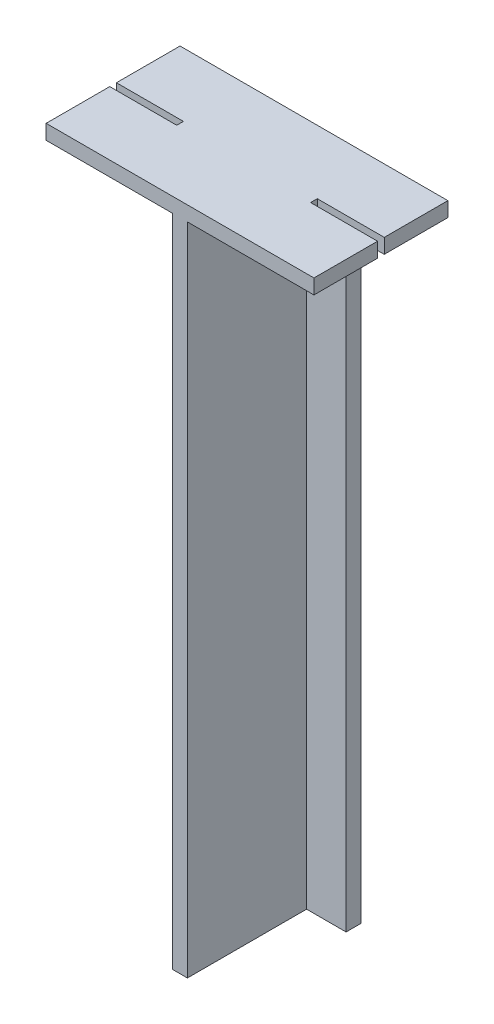
ISO-10303-21;
HEADER;
FILE_DESCRIPTION(('STEP AP214'),'2;1');
FILE_NAME('part.step','',(''),(''),'','','');
FILE_SCHEMA(('AUTOMOTIVE_DESIGN { 1 0 10303 214 1 1 1 1 }'));
ENDSEC;
DATA;
#1=APPLICATION_CONTEXT('core data for automotive mechanical design processes');
#2=APPLICATION_PROTOCOL_DEFINITION('international standard','automotive_design',2000,#1);
#3=PRODUCT_CONTEXT('',#1,'mechanical');
#4=PRODUCT('Part','Part','',(#3));
#5=PRODUCT_RELATED_PRODUCT_CATEGORY('part','',(#4));
#6=PRODUCT_DEFINITION_FORMATION('','',#4);
#7=PRODUCT_DEFINITION_CONTEXT('part definition',#1,'design');
#8=PRODUCT_DEFINITION('design','',#6,#7);
#9=PRODUCT_DEFINITION_SHAPE('','',#8);
#10=(LENGTH_UNIT() NAMED_UNIT(*) SI_UNIT(.MILLI.,.METRE.));
#11=(NAMED_UNIT(*) PLANE_ANGLE_UNIT() SI_UNIT($,.RADIAN.));
#12=(NAMED_UNIT(*) SI_UNIT($,.STERADIAN.) SOLID_ANGLE_UNIT());
#13=UNCERTAINTY_MEASURE_WITH_UNIT(LENGTH_MEASURE(1.E-05),#10,'distance_accuracy_value','');
#14=(GEOMETRIC_REPRESENTATION_CONTEXT(3) GLOBAL_UNCERTAINTY_ASSIGNED_CONTEXT((#13)) GLOBAL_UNIT_ASSIGNED_CONTEXT((#10,
#11,#12)) REPRESENTATION_CONTEXT('',''));
#15=CARTESIAN_POINT('',(0.,0.,0.));
#16=DIRECTION('',(0.,0.,1.));
#17=DIRECTION('',(1.,0.,0.));
#18=AXIS2_PLACEMENT_3D('',#15,#16,#17);
#19=CARTESIAN_POINT('',(0.,0.,0.));
#20=DIRECTION('',(0.,1.,0.));
#21=DIRECTION('',(0.,0.,1.));
#22=AXIS2_PLACEMENT_3D('',#19,#20,#21);
#23=PLANE('',#22);
#24=DIRECTION('',(0.,0.,1.));
#25=VECTOR('',#24,1.);
#26=CARTESIAN_POINT('',(70.,0.,0.));
#27=LINE('',#26,#25);
#28=CARTESIAN_POINT('',(70.,0.,-200.));
#29=VERTEX_POINT('',#28);
#30=CARTESIAN_POINT('',(70.,0.,-178.));
#31=VERTEX_POINT('',#30);
#32=EDGE_CURVE('E11',#29,#31,#27,.T.);
#33=ORIENTED_EDGE('',*,*,#32,.F.);
#34=DIRECTION('',(-1.,0.,0.));
#35=VECTOR('',#34,1.);
#36=CARTESIAN_POINT('',(0.,0.,-200.));
#37=LINE('',#36,#35);
#38=CARTESIAN_POINT('',(200.,0.,-200.));
#39=VERTEX_POINT('',#38);
#40=EDGE_CURVE('E385',#39,#29,#37,.T.);
#41=ORIENTED_EDGE('',*,*,#40,.F.);
#42=DIRECTION('',(0.,0.,-1.));
#43=VECTOR('',#42,1.);
#44=CARTESIAN_POINT('',(200.,0.,0.));
#45=LINE('',#44,#43);
#46=CARTESIAN_POINT('',(200.,0.,-105.));
#47=VERTEX_POINT('',#46);
#48=EDGE_CURVE('E166',#47,#39,#45,.T.);
#49=ORIENTED_EDGE('',*,*,#48,.F.);
#50=DIRECTION('',(-1.,0.,0.));
#51=VECTOR('',#50,1.);
#52=CARTESIAN_POINT('',(0.,0.,-105.));
#53=LINE('',#52,#51);
#54=CARTESIAN_POINT('',(100.,0.,-105.));
#55=VERTEX_POINT('',#54);
#56=EDGE_CURVE('E169',#47,#55,#53,.T.);
#57=ORIENTED_EDGE('',*,*,#56,.T.);
#58=DIRECTION('',(0.,0.,-1.));
#59=VECTOR('',#58,1.);
#60=CARTESIAN_POINT('',(100.,0.,0.));
#61=LINE('',#60,#59);
#62=CARTESIAN_POINT('',(100.,0.,-95.));
#63=VERTEX_POINT('',#62);
#64=EDGE_CURVE('E172',#63,#55,#61,.T.);
#65=ORIENTED_EDGE('',*,*,#64,.F.);
#66=DIRECTION('',(-1.,0.,0.));
#67=VECTOR('',#66,1.);
#68=CARTESIAN_POINT('',(0.,0.,-95.0000000000001));
#69=LINE('',#68,#67);
#70=CARTESIAN_POINT('',(200.,0.,-95.));
#71=VERTEX_POINT('',#70);
#72=EDGE_CURVE('E161',#71,#63,#69,.T.);
#73=ORIENTED_EDGE('',*,*,#72,.F.);
#74=CARTESIAN_POINT('',(200.,0.,0.));
#75=VERTEX_POINT('',#74);
#76=EDGE_CURVE('E165',#75,#71,#45,.T.);
#77=ORIENTED_EDGE('',*,*,#76,.F.);
#78=DIRECTION('',(-1.,0.,0.));
#79=VECTOR('',#78,1.);
#80=CARTESIAN_POINT('',(0.,0.,0.));
#81=LINE('',#80,#79);
#82=CARTESIAN_POINT('',(11.,0.,0.));
#83=VERTEX_POINT('',#82);
#84=EDGE_CURVE('E368',#75,#83,#81,.T.);
#85=ORIENTED_EDGE('',*,*,#84,.T.);
#86=DIRECTION('',(0.,0.,1.));
#87=VECTOR('',#86,1.);
#88=CARTESIAN_POINT('',(11.,0.,0.));
#89=LINE('',#88,#87);
#90=CARTESIAN_POINT('',(11.,0.,-178.));
#91=VERTEX_POINT('',#90);
#92=EDGE_CURVE('E361',#91,#83,#89,.T.);
#93=ORIENTED_EDGE('',*,*,#92,.F.);
#94=DIRECTION('',(1.,0.,0.));
#95=VECTOR('',#94,1.);
#96=CARTESIAN_POINT('',(0.,0.,-178.));
#97=LINE('',#96,#95);
#98=EDGE_CURVE('E40',#91,#31,#97,.T.);
#99=ORIENTED_EDGE('',*,*,#98,.T.);
#100=EDGE_LOOP('',(#33,#41,#49,#57,#65,#73,#77,#85,#93,#99));
#101=FACE_BOUND('',#100,.T.);
#102=ADVANCED_FACE('F32',(#101),#23,.F.);
#103=CARTESIAN_POINT('',(-100.,22.,0.));
#104=DIRECTION('',(-1.,0.,0.));
#105=DIRECTION('',(0.,0.,1.));
#106=AXIS2_PLACEMENT_3D('',#103,#104,#105);
#107=PLANE('',#106);
#108=DIRECTION('',(0.,0.,-1.));
#109=VECTOR('',#108,1.);
#110=CARTESIAN_POINT('',(-100.,0.,0.));
#111=LINE('',#110,#109);
#112=CARTESIAN_POINT('',(-100.,0.,-95.));
#113=VERTEX_POINT('',#112);
#114=CARTESIAN_POINT('',(-100.,0.,-105.));
#115=VERTEX_POINT('',#114);
#116=EDGE_CURVE('E145',#113,#115,#111,.T.);
#117=ORIENTED_EDGE('',*,*,#116,.F.);
#118=DIRECTION('',(0.,-1.,0.));
#119=VECTOR('',#118,1.);
#120=CARTESIAN_POINT('',(-100.,22.,-95.));
#121=LINE('',#120,#119);
#122=CARTESIAN_POINT('',(-100.,22.,-95.));
#123=VERTEX_POINT('',#122);
#124=EDGE_CURVE('E88',#123,#113,#121,.T.);
#125=ORIENTED_EDGE('',*,*,#124,.F.);
#126=DIRECTION('',(0.,0.,-1.));
#127=VECTOR('',#126,1.);
#128=CARTESIAN_POINT('',(-100.,22.,0.));
#129=LINE('',#128,#127);
#130=CARTESIAN_POINT('',(-100.,22.,-105.));
#131=VERTEX_POINT('',#130);
#132=EDGE_CURVE('E136',#123,#131,#129,.T.);
#133=ORIENTED_EDGE('',*,*,#132,.T.);
#134=DIRECTION('',(0.,-1.,0.));
#135=VECTOR('',#134,1.);
#136=CARTESIAN_POINT('',(-100.,22.,-105.));
#137=LINE('',#136,#135);
#138=EDGE_CURVE('E83',#131,#115,#137,.T.);
#139=ORIENTED_EDGE('',*,*,#138,.T.);
#140=EDGE_LOOP('',(#117,#125,#133,#139));
#141=FACE_BOUND('',#140,.T.);
#142=ADVANCED_FACE('F34',(#141),#107,.T.);
#143=CARTESIAN_POINT('',(0.,22.,-95.0000000000001));
#144=DIRECTION('',(0.,0.,-1.));
#145=DIRECTION('',(-1.,0.,0.));
#146=AXIS2_PLACEMENT_3D('',#143,#144,#145);
#147=PLANE('',#146);
#148=DIRECTION('',(1.,0.,0.));
#149=VECTOR('',#148,1.);
#150=CARTESIAN_POINT('',(0.,0.,-95.0000000000001));
#151=LINE('',#150,#149);
#152=CARTESIAN_POINT('',(-200.,0.,-95.));
#153=VERTEX_POINT('',#152);
#154=EDGE_CURVE('E400',#153,#113,#151,.T.);
#155=ORIENTED_EDGE('',*,*,#154,.F.);
#156=DIRECTION('',(0.,-1.,0.));
#157=VECTOR('',#156,1.);
#158=CARTESIAN_POINT('',(-200.,22.,-95.));
#159=LINE('',#158,#157);
#160=CARTESIAN_POINT('',(-200.,22.,-95.));
#161=VERTEX_POINT('',#160);
#162=EDGE_CURVE('E397',#161,#153,#159,.T.);
#163=ORIENTED_EDGE('',*,*,#162,.F.);
#164=DIRECTION('',(1.,0.,0.));
#165=VECTOR('',#164,1.);
#166=CARTESIAN_POINT('',(0.,22.,-95.0000000000001));
#167=LINE('',#166,#165);
#168=EDGE_CURVE('E131',#161,#123,#167,.T.);
#169=ORIENTED_EDGE('',*,*,#168,.T.);
#170=ORIENTED_EDGE('',*,*,#124,.T.);
#171=EDGE_LOOP('',(#155,#163,#169,#170));
#172=FACE_BOUND('',#171,.T.);
#173=ADVANCED_FACE('F340',(#172),#147,.T.);
#174=CARTESIAN_POINT('',(-200.,22.,0.));
#175=DIRECTION('',(-1.,0.,0.));
#176=DIRECTION('',(0.,0.,1.));
#177=AXIS2_PLACEMENT_3D('',#174,#175,#176);
#178=PLANE('',#177);
#179=DIRECTION('',(0.,0.,-1.));
#180=VECTOR('',#179,1.);
#181=CARTESIAN_POINT('',(-200.,0.,0.));
#182=LINE('',#181,#180);
#183=CARTESIAN_POINT('',(-200.,0.,0.));
#184=VERTEX_POINT('',#183);
#185=EDGE_CURVE('E390',#184,#153,#182,.T.);
#186=ORIENTED_EDGE('',*,*,#185,.F.);
#187=DIRECTION('',(0.,-1.,0.));
#188=VECTOR('',#187,1.);
#189=CARTESIAN_POINT('',(-200.,22.,0.));
#190=LINE('',#189,#188);
#191=CARTESIAN_POINT('',(-200.,22.,0.));
#192=VERTEX_POINT('',#191);
#193=EDGE_CURVE('E121',#192,#184,#190,.T.);
#194=ORIENTED_EDGE('',*,*,#193,.F.);
#195=DIRECTION('',(0.,0.,-1.));
#196=VECTOR('',#195,1.);
#197=CARTESIAN_POINT('',(-200.,22.,0.));
#198=LINE('',#197,#196);
#199=EDGE_CURVE('E126',#192,#161,#198,.T.);
#200=ORIENTED_EDGE('',*,*,#199,.T.);
#201=ORIENTED_EDGE('',*,*,#162,.T.);
#202=EDGE_LOOP('',(#186,#194,#200,#201));
#203=FACE_BOUND('',#202,.T.);
#204=ADVANCED_FACE('F407',(#203),#178,.T.);
#205=CARTESIAN_POINT('',(0.,22.,0.));
#206=DIRECTION('',(0.,0.,1.));
#207=DIRECTION('',(1.,0.,0.));
#208=AXIS2_PLACEMENT_3D('',#205,#206,#207);
#209=PLANE('',#208);
#210=CARTESIAN_POINT('',(-11.,0.,0.));
#211=VERTEX_POINT('',#210);
#212=EDGE_CURVE('E372',#211,#184,#81,.T.);
#213=ORIENTED_EDGE('',*,*,#212,.F.);
#214=DIRECTION('',(0.,1.,0.));
#215=VECTOR('',#214,1.);
#216=CARTESIAN_POINT('',(-11.,-978.,0.));
#217=LINE('',#216,#215);
#218=CARTESIAN_POINT('',(-11.,-978.,0.));
#219=VERTEX_POINT('',#218);
#220=EDGE_CURVE('E196',#219,#211,#217,.T.);
#221=ORIENTED_EDGE('',*,*,#220,.F.);
#222=DIRECTION('',(1.,0.,0.));
#223=VECTOR('',#222,1.);
#224=CARTESIAN_POINT('',(0.,-978.,0.));
#225=LINE('',#224,#223);
#226=CARTESIAN_POINT('',(11.,-978.,0.));
#227=VERTEX_POINT('',#226);
#228=EDGE_CURVE('E210',#219,#227,#225,.T.);
#229=ORIENTED_EDGE('',*,*,#228,.T.);
#230=DIRECTION('',(0.,1.,0.));
#231=VECTOR('',#230,1.);
#232=CARTESIAN_POINT('',(11.,-978.,0.));
#233=LINE('',#232,#231);
#234=EDGE_CURVE('E199',#227,#83,#233,.T.);
#235=ORIENTED_EDGE('',*,*,#234,.T.);
#236=ORIENTED_EDGE('',*,*,#84,.F.);
#237=DIRECTION('',(0.,-1.,0.));
#238=VECTOR('',#237,1.);
#239=CARTESIAN_POINT('',(200.,22.,0.));
#240=LINE('',#239,#238);
#241=CARTESIAN_POINT('',(200.,22.,0.));
#242=VERTEX_POINT('',#241);
#243=EDGE_CURVE('E151',#242,#75,#240,.T.);
#244=ORIENTED_EDGE('',*,*,#243,.F.);
#245=DIRECTION('',(-1.,0.,0.));
#246=VECTOR('',#245,1.);
#247=CARTESIAN_POINT('',(0.,22.,0.));
#248=LINE('',#247,#246);
#249=EDGE_CURVE('E111',#242,#192,#248,.T.);
#250=ORIENTED_EDGE('',*,*,#249,.T.);
#251=ORIENTED_EDGE('',*,*,#193,.T.);
#252=EDGE_LOOP('',(#213,#221,#229,#235,#236,#244,#250,#251));
#253=FACE_BOUND('',#252,.T.);
#254=ADVANCED_FACE('F370',(#253),#209,.T.);
#255=CARTESIAN_POINT('',(0.,22.,-200.));
#256=DIRECTION('',(0.,0.,1.));
#257=DIRECTION('',(1.,0.,0.));
#258=AXIS2_PLACEMENT_3D('',#255,#256,#257);
#259=PLANE('',#258);
#260=DIRECTION('',(0.,-1.,0.));
#261=VECTOR('',#260,1.);
#262=CARTESIAN_POINT('',(-200.,22.,-200.));
#263=LINE('',#262,#261);
#264=CARTESIAN_POINT('',(-200.,22.,-200.));
#265=VERTEX_POINT('',#264);
#266=CARTESIAN_POINT('',(-200.,0.,-200.));
#267=VERTEX_POINT('',#266);
#268=EDGE_CURVE('E114',#265,#267,#263,.T.);
#269=ORIENTED_EDGE('',*,*,#268,.F.);
#270=DIRECTION('',(-1.,0.,0.));
#271=VECTOR('',#270,1.);
#272=CARTESIAN_POINT('',(0.,22.,-200.));
#273=LINE('',#272,#271);
#274=CARTESIAN_POINT('',(200.,22.,-200.));
#275=VERTEX_POINT('',#274);
#276=EDGE_CURVE('E100',#275,#265,#273,.T.);
#277=ORIENTED_EDGE('',*,*,#276,.F.);
#278=DIRECTION('',(0.,-1.,0.));
#279=VECTOR('',#278,1.);
#280=CARTESIAN_POINT('',(200.,22.,-200.));
#281=LINE('',#280,#279);
#282=EDGE_CURVE('E149',#275,#39,#281,.T.);
#283=ORIENTED_EDGE('',*,*,#282,.T.);
#284=ORIENTED_EDGE('',*,*,#40,.T.);
#285=DIRECTION('',(0.,1.,0.));
#286=VECTOR('',#285,1.);
#287=CARTESIAN_POINT('',(70.,-978.,-200.));
#288=LINE('',#287,#286);
#289=CARTESIAN_POINT('',(70.,-978.,-200.));
#290=VERTEX_POINT('',#289);
#291=EDGE_CURVE('E185',#290,#29,#288,.T.);
#292=ORIENTED_EDGE('',*,*,#291,.F.);
#293=DIRECTION('',(-1.,0.,0.));
#294=VECTOR('',#293,1.);
#295=CARTESIAN_POINT('',(0.,-978.,-200.));
#296=LINE('',#295,#294);
#297=CARTESIAN_POINT('',(-70.,-978.,-200.));
#298=VERTEX_POINT('',#297);
#299=EDGE_CURVE('E222',#290,#298,#296,.T.);
#300=ORIENTED_EDGE('',*,*,#299,.T.);
#301=DIRECTION('',(0.,1.,0.));
#302=VECTOR('',#301,1.);
#303=CARTESIAN_POINT('',(-70.,-978.,-200.));
#304=LINE('',#303,#302);
#305=CARTESIAN_POINT('',(-70.,0.,-200.));
#306=VERTEX_POINT('',#305);
#307=EDGE_CURVE('E47',#298,#306,#304,.T.);
#308=ORIENTED_EDGE('',*,*,#307,.T.);
#309=EDGE_CURVE('E117',#306,#267,#37,.T.);
#310=ORIENTED_EDGE('',*,*,#309,.T.);
#311=EDGE_LOOP('',(#269,#277,#283,#284,#292,#300,#308,#310));
#312=FACE_BOUND('',#311,.T.);
#313=ADVANCED_FACE('F115',(#312),#259,.F.);
#314=CARTESIAN_POINT('',(-200.,0.,-105.));
#315=VERTEX_POINT('',#314);
#316=EDGE_CURVE('E387',#315,#267,#182,.T.);
#317=ORIENTED_EDGE('',*,*,#316,.F.);
#318=DIRECTION('',(0.,-1.,0.));
#319=VECTOR('',#318,1.);
#320=CARTESIAN_POINT('',(-200.,22.,-105.));
#321=LINE('',#320,#319);
#322=CARTESIAN_POINT('',(-200.,22.,-105.));
#323=VERTEX_POINT('',#322);
#324=EDGE_CURVE('E122',#323,#315,#321,.T.);
#325=ORIENTED_EDGE('',*,*,#324,.F.);
#326=EDGE_CURVE('E104',#323,#265,#198,.T.);
#327=ORIENTED_EDGE('',*,*,#326,.T.);
#328=ORIENTED_EDGE('',*,*,#268,.T.);
#329=EDGE_LOOP('',(#317,#325,#327,#328));
#330=FACE_BOUND('',#329,.T.);
#331=ADVANCED_FACE('F124',(#330),#178,.T.);
#332=CARTESIAN_POINT('',(0.,22.,-105.));
#333=DIRECTION('',(0.,0.,-1.));
#334=DIRECTION('',(-1.,0.,0.));
#335=AXIS2_PLACEMENT_3D('',#332,#333,#334);
#336=PLANE('',#335);
#337=DIRECTION('',(1.,0.,0.));
#338=VECTOR('',#337,1.);
#339=CARTESIAN_POINT('',(0.,0.,-105.));
#340=LINE('',#339,#338);
#341=EDGE_CURVE('E139',#315,#115,#340,.T.);
#342=ORIENTED_EDGE('',*,*,#341,.T.);
#343=ORIENTED_EDGE('',*,*,#138,.F.);
#344=DIRECTION('',(1.,0.,0.));
#345=VECTOR('',#344,1.);
#346=CARTESIAN_POINT('',(0.,22.,-105.));
#347=LINE('',#346,#345);
#348=EDGE_CURVE('E56',#323,#131,#347,.T.);
#349=ORIENTED_EDGE('',*,*,#348,.F.);
#350=ORIENTED_EDGE('',*,*,#324,.T.);
#351=EDGE_LOOP('',(#342,#343,#349,#350));
#352=FACE_BOUND('',#351,.T.);
#353=ADVANCED_FACE('F350',(#352),#336,.F.);
#354=CARTESIAN_POINT('',(0.,22.,0.));
#355=DIRECTION('',(0.,1.,0.));
#356=DIRECTION('',(0.,0.,1.));
#357=AXIS2_PLACEMENT_3D('',#354,#355,#356);
#358=PLANE('',#357);
#359=ORIENTED_EDGE('',*,*,#276,.T.);
#360=ORIENTED_EDGE('',*,*,#326,.F.);
#361=ORIENTED_EDGE('',*,*,#348,.T.);
#362=ORIENTED_EDGE('',*,*,#132,.F.);
#363=ORIENTED_EDGE('',*,*,#168,.F.);
#364=ORIENTED_EDGE('',*,*,#199,.F.);
#365=ORIENTED_EDGE('',*,*,#249,.F.);
#366=DIRECTION('',(0.,0.,-1.));
#367=VECTOR('',#366,1.);
#368=CARTESIAN_POINT('',(200.,22.,0.));
#369=LINE('',#368,#367);
#370=CARTESIAN_POINT('',(200.,22.,-95.));
#371=VERTEX_POINT('',#370);
#372=EDGE_CURVE('E178',#242,#371,#369,.T.);
#373=ORIENTED_EDGE('',*,*,#372,.T.);
#374=DIRECTION('',(-1.,0.,0.));
#375=VECTOR('',#374,1.);
#376=CARTESIAN_POINT('',(0.,22.,-95.0000000000001));
#377=LINE('',#376,#375);
#378=CARTESIAN_POINT('',(100.,22.,-95.));
#379=VERTEX_POINT('',#378);
#380=EDGE_CURVE('E160',#371,#379,#377,.T.);
#381=ORIENTED_EDGE('',*,*,#380,.T.);
#382=DIRECTION('',(0.,0.,-1.));
#383=VECTOR('',#382,1.);
#384=CARTESIAN_POINT('',(100.,22.,0.));
#385=LINE('',#384,#383);
#386=CARTESIAN_POINT('',(100.,22.,-105.));
#387=VERTEX_POINT('',#386);
#388=EDGE_CURVE('E164',#379,#387,#385,.T.);
#389=ORIENTED_EDGE('',*,*,#388,.T.);
#390=DIRECTION('',(-1.,0.,0.));
#391=VECTOR('',#390,1.);
#392=CARTESIAN_POINT('',(0.,22.,-105.));
#393=LINE('',#392,#391);
#394=CARTESIAN_POINT('',(200.,22.,-105.));
#395=VERTEX_POINT('',#394);
#396=EDGE_CURVE('E180',#395,#387,#393,.T.);
#397=ORIENTED_EDGE('',*,*,#396,.F.);
#398=EDGE_CURVE('E108',#395,#275,#369,.T.);
#399=ORIENTED_EDGE('',*,*,#398,.T.);
#400=EDGE_LOOP('',(#359,#360,#361,#362,#363,#364,#365,#373,#381,#389,#397,#399));
#401=FACE_BOUND('',#400,.T.);
#402=ADVANCED_FACE('F102',(#401),#358,.T.);
#403=DIRECTION('',(1.,0.,0.));
#404=VECTOR('',#403,1.);
#405=CARTESIAN_POINT('',(0.,0.,-178.));
#406=LINE('',#405,#404);
#407=CARTESIAN_POINT('',(-70.,0.,-178.));
#408=VERTEX_POINT('',#407);
#409=CARTESIAN_POINT('',(-11.,0.,-178.));
#410=VERTEX_POINT('',#409);
#411=EDGE_CURVE('E354',#408,#410,#406,.T.);
#412=ORIENTED_EDGE('',*,*,#411,.T.);
#413=DIRECTION('',(0.,0.,1.));
#414=VECTOR('',#413,1.);
#415=CARTESIAN_POINT('',(-11.,0.,0.));
#416=LINE('',#415,#414);
#417=EDGE_CURVE('E355',#410,#211,#416,.T.);
#418=ORIENTED_EDGE('',*,*,#417,.T.);
#419=ORIENTED_EDGE('',*,*,#212,.T.);
#420=ORIENTED_EDGE('',*,*,#185,.T.);
#421=ORIENTED_EDGE('',*,*,#154,.T.);
#422=ORIENTED_EDGE('',*,*,#116,.T.);
#423=ORIENTED_EDGE('',*,*,#341,.F.);
#424=ORIENTED_EDGE('',*,*,#316,.T.);
#425=ORIENTED_EDGE('',*,*,#309,.F.);
#426=DIRECTION('',(0.,0.,1.));
#427=VECTOR('',#426,1.);
#428=CARTESIAN_POINT('',(-69.9999999999999,0.,0.));
#429=LINE('',#428,#427);
#430=EDGE_CURVE('E357',#306,#408,#429,.T.);
#431=ORIENTED_EDGE('',*,*,#430,.T.);
#432=EDGE_LOOP('',(#412,#418,#419,#420,#421,#422,#423,#424,#425,#431));
#433=FACE_BOUND('',#432,.T.);
#434=ADVANCED_FACE('F336',(#433),#23,.F.);
#435=CARTESIAN_POINT('',(100.,22.,0.));
#436=DIRECTION('',(-1.,0.,0.));
#437=DIRECTION('',(0.,0.,1.));
#438=AXIS2_PLACEMENT_3D('',#435,#436,#437);
#439=PLANE('',#438);
#440=ORIENTED_EDGE('',*,*,#64,.T.);
#441=DIRECTION('',(0.,-1.,0.));
#442=VECTOR('',#441,1.);
#443=CARTESIAN_POINT('',(100.,22.,-105.));
#444=LINE('',#443,#442);
#445=EDGE_CURVE('E142',#387,#55,#444,.T.);
#446=ORIENTED_EDGE('',*,*,#445,.F.);
#447=ORIENTED_EDGE('',*,*,#388,.F.);
#448=DIRECTION('',(0.,-1.,0.));
#449=VECTOR('',#448,1.);
#450=CARTESIAN_POINT('',(100.,22.,-95.));
#451=LINE('',#450,#449);
#452=EDGE_CURVE('E157',#379,#63,#451,.T.);
#453=ORIENTED_EDGE('',*,*,#452,.T.);
#454=EDGE_LOOP('',(#440,#446,#447,#453));
#455=FACE_BOUND('',#454,.T.);
#456=ADVANCED_FACE('F315',(#455),#439,.F.);
#457=CARTESIAN_POINT('',(0.,22.,-105.));
#458=DIRECTION('',(0.,0.,1.));
#459=DIRECTION('',(1.,0.,0.));
#460=AXIS2_PLACEMENT_3D('',#457,#458,#459);
#461=PLANE('',#460);
#462=ORIENTED_EDGE('',*,*,#56,.F.);
#463=DIRECTION('',(0.,-1.,0.));
#464=VECTOR('',#463,1.);
#465=CARTESIAN_POINT('',(200.,22.,-105.));
#466=LINE('',#465,#464);
#467=EDGE_CURVE('E146',#395,#47,#466,.T.);
#468=ORIENTED_EDGE('',*,*,#467,.F.);
#469=ORIENTED_EDGE('',*,*,#396,.T.);
#470=ORIENTED_EDGE('',*,*,#445,.T.);
#471=EDGE_LOOP('',(#462,#468,#469,#470));
#472=FACE_BOUND('',#471,.T.);
#473=ADVANCED_FACE('F320',(#472),#461,.T.);
#474=CARTESIAN_POINT('',(200.,22.,0.));
#475=DIRECTION('',(-1.,0.,0.));
#476=DIRECTION('',(0.,0.,1.));
#477=AXIS2_PLACEMENT_3D('',#474,#475,#476);
#478=PLANE('',#477);
#479=ORIENTED_EDGE('',*,*,#48,.T.);
#480=ORIENTED_EDGE('',*,*,#282,.F.);
#481=ORIENTED_EDGE('',*,*,#398,.F.);
#482=ORIENTED_EDGE('',*,*,#467,.T.);
#483=EDGE_LOOP('',(#479,#480,#481,#482));
#484=FACE_BOUND('',#483,.T.);
#485=ADVANCED_FACE('F325',(#484),#478,.F.);
#486=ORIENTED_EDGE('',*,*,#76,.T.);
#487=DIRECTION('',(0.,-1.,0.));
#488=VECTOR('',#487,1.);
#489=CARTESIAN_POINT('',(200.,22.,-95.));
#490=LINE('',#489,#488);
#491=EDGE_CURVE('E154',#371,#71,#490,.T.);
#492=ORIENTED_EDGE('',*,*,#491,.F.);
#493=ORIENTED_EDGE('',*,*,#372,.F.);
#494=ORIENTED_EDGE('',*,*,#243,.T.);
#495=EDGE_LOOP('',(#486,#492,#493,#494));
#496=FACE_BOUND('',#495,.T.);
#497=ADVANCED_FACE('F323',(#496),#478,.F.);
#498=CARTESIAN_POINT('',(0.,22.,-95.0000000000001));
#499=DIRECTION('',(0.,0.,1.));
#500=DIRECTION('',(1.,0.,0.));
#501=AXIS2_PLACEMENT_3D('',#498,#499,#500);
#502=PLANE('',#501);
#503=ORIENTED_EDGE('',*,*,#72,.T.);
#504=ORIENTED_EDGE('',*,*,#452,.F.);
#505=ORIENTED_EDGE('',*,*,#380,.F.);
#506=ORIENTED_EDGE('',*,*,#491,.T.);
#507=EDGE_LOOP('',(#503,#504,#505,#506));
#508=FACE_BOUND('',#507,.T.);
#509=ADVANCED_FACE('F309',(#508),#502,.F.);
#510=CARTESIAN_POINT('',(70.,-978.,0.));
#511=DIRECTION('',(-1.,0.,0.));
#512=DIRECTION('',(0.,0.,1.));
#513=AXIS2_PLACEMENT_3D('',#510,#511,#512);
#514=PLANE('',#513);
#515=ORIENTED_EDGE('',*,*,#291,.T.);
#516=ORIENTED_EDGE('',*,*,#32,.T.);
#517=DIRECTION('',(0.,1.,0.));
#518=VECTOR('',#517,1.);
#519=CARTESIAN_POINT('',(70.,-978.,-178.));
#520=LINE('',#519,#518);
#521=CARTESIAN_POINT('',(70.,-978.,-178.));
#522=VERTEX_POINT('',#521);
#523=EDGE_CURVE('E175',#522,#31,#520,.T.);
#524=ORIENTED_EDGE('',*,*,#523,.F.);
#525=DIRECTION('',(0.,0.,1.));
#526=VECTOR('',#525,1.);
#527=CARTESIAN_POINT('',(70.,-978.,0.));
#528=LINE('',#527,#526);
#529=EDGE_CURVE('E224',#290,#522,#528,.T.);
#530=ORIENTED_EDGE('',*,*,#529,.F.);
#531=EDGE_LOOP('',(#515,#516,#524,#530));
#532=FACE_BOUND('',#531,.T.);
#533=ADVANCED_FACE('F240',(#532),#514,.F.);
#534=CARTESIAN_POINT('',(0.,-978.,-178.));
#535=DIRECTION('',(0.,0.,1.));
#536=DIRECTION('',(1.,0.,0.));
#537=AXIS2_PLACEMENT_3D('',#534,#535,#536);
#538=PLANE('',#537);
#539=ORIENTED_EDGE('',*,*,#98,.F.);
#540=DIRECTION('',(0.,1.,0.));
#541=VECTOR('',#540,1.);
#542=CARTESIAN_POINT('',(11.,-978.,-178.));
#543=LINE('',#542,#541);
#544=CARTESIAN_POINT('',(11.,-978.,-178.));
#545=VERTEX_POINT('',#544);
#546=EDGE_CURVE('E202',#545,#91,#543,.T.);
#547=ORIENTED_EDGE('',*,*,#546,.F.);
#548=DIRECTION('',(1.,0.,0.));
#549=VECTOR('',#548,1.);
#550=CARTESIAN_POINT('',(0.,-978.,-178.));
#551=LINE('',#550,#549);
#552=EDGE_CURVE('E188',#545,#522,#551,.T.);
#553=ORIENTED_EDGE('',*,*,#552,.T.);
#554=ORIENTED_EDGE('',*,*,#523,.T.);
#555=EDGE_LOOP('',(#539,#547,#553,#554));
#556=FACE_BOUND('',#555,.T.);
#557=ADVANCED_FACE('F247',(#556),#538,.T.);
#558=CARTESIAN_POINT('',(11.,-978.,0.));
#559=DIRECTION('',(-1.,0.,0.));
#560=DIRECTION('',(0.,0.,1.));
#561=AXIS2_PLACEMENT_3D('',#558,#559,#560);
#562=PLANE('',#561);
#563=ORIENTED_EDGE('',*,*,#546,.T.);
#564=ORIENTED_EDGE('',*,*,#92,.T.);
#565=ORIENTED_EDGE('',*,*,#234,.F.);
#566=DIRECTION('',(0.,0.,1.));
#567=VECTOR('',#566,1.);
#568=CARTESIAN_POINT('',(11.,-978.,0.));
#569=LINE('',#568,#567);
#570=EDGE_CURVE('E207',#545,#227,#569,.T.);
#571=ORIENTED_EDGE('',*,*,#570,.F.);
#572=EDGE_LOOP('',(#563,#564,#565,#571));
#573=FACE_BOUND('',#572,.T.);
#574=ADVANCED_FACE('F256',(#573),#562,.F.);
#575=CARTESIAN_POINT('',(-11.,-978.,0.));
#576=DIRECTION('',(-1.,0.,0.));
#577=DIRECTION('',(0.,0.,1.));
#578=AXIS2_PLACEMENT_3D('',#575,#576,#577);
#579=PLANE('',#578);
#580=ORIENTED_EDGE('',*,*,#417,.F.);
#581=DIRECTION('',(0.,1.,0.));
#582=VECTOR('',#581,1.);
#583=CARTESIAN_POINT('',(-11.,-978.,-178.));
#584=LINE('',#583,#582);
#585=CARTESIAN_POINT('',(-11.,-978.,-178.));
#586=VERTEX_POINT('',#585);
#587=EDGE_CURVE('E193',#586,#410,#584,.T.);
#588=ORIENTED_EDGE('',*,*,#587,.F.);
#589=DIRECTION('',(0.,0.,1.));
#590=VECTOR('',#589,1.);
#591=CARTESIAN_POINT('',(-11.,-978.,0.));
#592=LINE('',#591,#590);
#593=EDGE_CURVE('E213',#586,#219,#592,.T.);
#594=ORIENTED_EDGE('',*,*,#593,.T.);
#595=ORIENTED_EDGE('',*,*,#220,.T.);
#596=EDGE_LOOP('',(#580,#588,#594,#595));
#597=FACE_BOUND('',#596,.T.);
#598=ADVANCED_FACE('F374',(#597),#579,.T.);
#599=ORIENTED_EDGE('',*,*,#411,.F.);
#600=DIRECTION('',(0.,1.,0.));
#601=VECTOR('',#600,1.);
#602=CARTESIAN_POINT('',(-70.,-978.,-178.));
#603=LINE('',#602,#601);
#604=CARTESIAN_POINT('',(-70.,-978.,-178.));
#605=VERTEX_POINT('',#604);
#606=EDGE_CURVE('E190',#605,#408,#603,.T.);
#607=ORIENTED_EDGE('',*,*,#606,.F.);
#608=EDGE_CURVE('E216',#605,#586,#551,.T.);
#609=ORIENTED_EDGE('',*,*,#608,.T.);
#610=ORIENTED_EDGE('',*,*,#587,.T.);
#611=EDGE_LOOP('',(#599,#607,#609,#610));
#612=FACE_BOUND('',#611,.T.);
#613=ADVANCED_FACE('F378',(#612),#538,.T.);
#614=CARTESIAN_POINT('',(-69.9999999999999,-978.,0.));
#615=DIRECTION('',(-1.,0.,0.));
#616=DIRECTION('',(0.,0.,1.));
#617=AXIS2_PLACEMENT_3D('',#614,#615,#616);
#618=PLANE('',#617);
#619=ORIENTED_EDGE('',*,*,#430,.F.);
#620=ORIENTED_EDGE('',*,*,#307,.F.);
#621=DIRECTION('',(0.,0.,1.));
#622=VECTOR('',#621,1.);
#623=CARTESIAN_POINT('',(-69.9999999999999,-978.,0.));
#624=LINE('',#623,#622);
#625=EDGE_CURVE('E219',#298,#605,#624,.T.);
#626=ORIENTED_EDGE('',*,*,#625,.T.);
#627=ORIENTED_EDGE('',*,*,#606,.T.);
#628=EDGE_LOOP('',(#619,#620,#626,#627));
#629=FACE_BOUND('',#628,.T.);
#630=ADVANCED_FACE('F382',(#629),#618,.T.);
#631=CARTESIAN_POINT('',(0.,-978.,0.));
#632=DIRECTION('',(0.,1.,0.));
#633=DIRECTION('',(0.,0.,1.));
#634=AXIS2_PLACEMENT_3D('',#631,#632,#633);
#635=PLANE('',#634);
#636=ORIENTED_EDGE('',*,*,#529,.T.);
#637=ORIENTED_EDGE('',*,*,#552,.F.);
#638=ORIENTED_EDGE('',*,*,#570,.T.);
#639=ORIENTED_EDGE('',*,*,#228,.F.);
#640=ORIENTED_EDGE('',*,*,#593,.F.);
#641=ORIENTED_EDGE('',*,*,#608,.F.);
#642=ORIENTED_EDGE('',*,*,#625,.F.);
#643=ORIENTED_EDGE('',*,*,#299,.F.);
#644=EDGE_LOOP('',(#636,#637,#638,#639,#640,#641,#642,#643));
#645=FACE_BOUND('',#644,.T.);
#646=ADVANCED_FACE('F232',(#645),#635,.F.);
#647=CLOSED_SHELL('',(#102,#142,#173,#204,#254,#313,#331,#353,#402,#434,#456,#473,#485,#497,
#509,#533,#557,#574,#598,#613,#630,#646));
#648=MANIFOLD_SOLID_BREP('B2',#647);
#649=ADVANCED_BREP_SHAPE_REPRESENTATION('',(#18,#648),#14);
#650=SHAPE_DEFINITION_REPRESENTATION(#9,#649);
ENDSEC;
END-ISO-10303-21;
